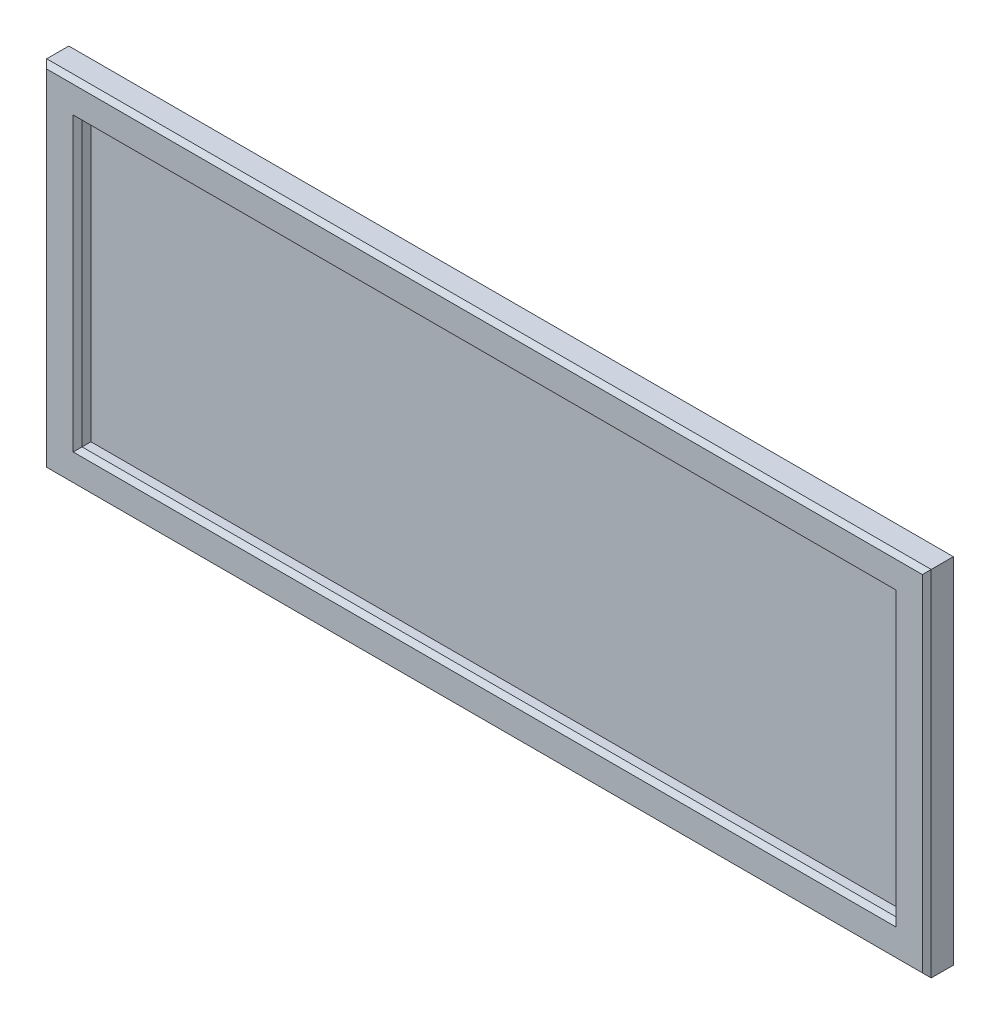
ISO-10303-21;
HEADER;
FILE_DESCRIPTION(('STEP AP214'),'2;1');
FILE_NAME('part.step','',(''),(''),'','','');
FILE_SCHEMA(('AUTOMOTIVE_DESIGN { 1 0 10303 214 1 1 1 1 }'));
ENDSEC;
DATA;
#1=APPLICATION_CONTEXT('core data for automotive mechanical design processes');
#2=APPLICATION_PROTOCOL_DEFINITION('international standard','automotive_design',2000,#1);
#3=PRODUCT_CONTEXT('',#1,'mechanical');
#4=PRODUCT('Part','Part','',(#3));
#5=PRODUCT_RELATED_PRODUCT_CATEGORY('part','',(#4));
#6=PRODUCT_DEFINITION_FORMATION('','',#4);
#7=PRODUCT_DEFINITION_CONTEXT('part definition',#1,'design');
#8=PRODUCT_DEFINITION('design','',#6,#7);
#9=PRODUCT_DEFINITION_SHAPE('','',#8);
#10=(LENGTH_UNIT() NAMED_UNIT(*) SI_UNIT(.MILLI.,.METRE.));
#11=(NAMED_UNIT(*) PLANE_ANGLE_UNIT() SI_UNIT($,.RADIAN.));
#12=(NAMED_UNIT(*) SI_UNIT($,.STERADIAN.) SOLID_ANGLE_UNIT());
#13=UNCERTAINTY_MEASURE_WITH_UNIT(LENGTH_MEASURE(1.E-05),#10,'distance_accuracy_value','');
#14=(GEOMETRIC_REPRESENTATION_CONTEXT(3) GLOBAL_UNCERTAINTY_ASSIGNED_CONTEXT((#13)) GLOBAL_UNIT_ASSIGNED_CONTEXT((#10,
#11,#12)) REPRESENTATION_CONTEXT('',''));
#15=CARTESIAN_POINT('',(0.,0.,0.));
#16=DIRECTION('',(0.,0.,1.));
#17=DIRECTION('',(1.,0.,0.));
#18=AXIS2_PLACEMENT_3D('',#15,#16,#17);
#19=CARTESIAN_POINT('',(1958.91593468016,752.055348931836,30.));
#20=DIRECTION('',(1.,0.,0.));
#21=DIRECTION('',(0.,0.,-1.));
#22=AXIS2_PLACEMENT_3D('',#19,#20,#21);
#23=PLANE('',#22);
#24=DIRECTION('',(0.,-1.,0.));
#25=VECTOR('',#24,1.);
#26=CARTESIAN_POINT('',(1958.91593468016,752.055348931836,20.));
#27=LINE('',#26,#25);
#28=CARTESIAN_POINT('',(1958.91593468016,752.055348931836,20.));
#29=VERTEX_POINT('',#28);
#30=CARTESIAN_POINT('',(1958.91593468016,37.5133814701847,20.));
#31=VERTEX_POINT('',#30);
#32=EDGE_CURVE('E119',#29,#31,#27,.T.);
#33=ORIENTED_EDGE('',*,*,#32,.F.);
#34=DIRECTION('',(0.,0.,-1.));
#35=VECTOR('',#34,1.);
#36=CARTESIAN_POINT('',(1958.91593468016,752.055348931836,30.));
#37=LINE('',#36,#35);
#38=CARTESIAN_POINT('',(1958.91593468016,752.055348931836,30.));
#39=VERTEX_POINT('',#38);
#40=EDGE_CURVE('E12',#39,#29,#37,.T.);
#41=ORIENTED_EDGE('',*,*,#40,.F.);
#42=DIRECTION('',(0.,-1.,0.));
#43=VECTOR('',#42,1.);
#44=CARTESIAN_POINT('',(1958.91593468016,752.055348931836,30.));
#45=LINE('',#44,#43);
#46=CARTESIAN_POINT('',(1958.91593468016,37.5133814701847,30.));
#47=VERTEX_POINT('',#46);
#48=EDGE_CURVE('E113',#39,#47,#45,.T.);
#49=ORIENTED_EDGE('',*,*,#48,.T.);
#50=DIRECTION('',(0.,0.,-1.));
#51=VECTOR('',#50,1.);
#52=CARTESIAN_POINT('',(1958.91593468016,37.5133814701847,30.));
#53=LINE('',#52,#51);
#54=EDGE_CURVE('E58',#47,#31,#53,.T.);
#55=ORIENTED_EDGE('',*,*,#54,.T.);
#56=EDGE_LOOP('',(#33,#41,#49,#55));
#57=FACE_BOUND('',#56,.T.);
#58=ADVANCED_FACE('F55',(#57),#23,.T.);
#59=CARTESIAN_POINT('',(1958.91593468016,752.055348931836,30.));
#60=DIRECTION('',(0.,1.,0.));
#61=DIRECTION('',(0.,0.,1.));
#62=AXIS2_PLACEMENT_3D('',#59,#60,#61);
#63=PLANE('',#62);
#64=DIRECTION('',(1.,0.,0.));
#65=VECTOR('',#64,1.);
#66=CARTESIAN_POINT('',(1958.91593468016,752.055348931836,20.));
#67=LINE('',#66,#65);
#68=CARTESIAN_POINT('',(41.8597438026764,752.055348931836,20.));
#69=VERTEX_POINT('',#68);
#70=EDGE_CURVE('E115',#69,#29,#67,.T.);
#71=ORIENTED_EDGE('',*,*,#70,.F.);
#72=DIRECTION('',(0.,0.,-1.));
#73=VECTOR('',#72,1.);
#74=CARTESIAN_POINT('',(41.8597438026764,752.055348931836,30.));
#75=LINE('',#74,#73);
#76=CARTESIAN_POINT('',(41.8597438026764,752.055348931836,30.));
#77=VERTEX_POINT('',#76);
#78=EDGE_CURVE('E64',#77,#69,#75,.T.);
#79=ORIENTED_EDGE('',*,*,#78,.F.);
#80=DIRECTION('',(1.,0.,0.));
#81=VECTOR('',#80,1.);
#82=CARTESIAN_POINT('',(1958.91593468016,752.055348931836,30.));
#83=LINE('',#82,#81);
#84=EDGE_CURVE('E110',#77,#39,#83,.T.);
#85=ORIENTED_EDGE('',*,*,#84,.T.);
#86=ORIENTED_EDGE('',*,*,#40,.T.);
#87=EDGE_LOOP('',(#71,#79,#85,#86));
#88=FACE_BOUND('',#87,.T.);
#89=ADVANCED_FACE('F129',(#88),#63,.T.);
#90=CARTESIAN_POINT('',(41.8597438026764,752.055348931836,30.));
#91=DIRECTION('',(-1.,0.,0.));
#92=DIRECTION('',(0.,0.,1.));
#93=AXIS2_PLACEMENT_3D('',#90,#91,#92);
#94=PLANE('',#93);
#95=DIRECTION('',(0.,1.,0.));
#96=VECTOR('',#95,1.);
#97=CARTESIAN_POINT('',(41.8597438026764,752.055348931836,20.));
#98=LINE('',#97,#96);
#99=CARTESIAN_POINT('',(41.8597438026764,37.5133814701847,20.));
#100=VERTEX_POINT('',#99);
#101=EDGE_CURVE('E105',#100,#69,#98,.T.);
#102=ORIENTED_EDGE('',*,*,#101,.F.);
#103=DIRECTION('',(0.,0.,-1.));
#104=VECTOR('',#103,1.);
#105=CARTESIAN_POINT('',(41.8597438026764,37.5133814701847,30.));
#106=LINE('',#105,#104);
#107=CARTESIAN_POINT('',(41.8597438026764,37.5133814701847,30.));
#108=VERTEX_POINT('',#107);
#109=EDGE_CURVE('E100',#108,#100,#106,.T.);
#110=ORIENTED_EDGE('',*,*,#109,.F.);
#111=DIRECTION('',(0.,1.,0.));
#112=VECTOR('',#111,1.);
#113=CARTESIAN_POINT('',(41.8597438026764,752.055348931836,30.));
#114=LINE('',#113,#112);
#115=EDGE_CURVE('E103',#108,#77,#114,.T.);
#116=ORIENTED_EDGE('',*,*,#115,.T.);
#117=ORIENTED_EDGE('',*,*,#78,.T.);
#118=EDGE_LOOP('',(#102,#110,#116,#117));
#119=FACE_BOUND('',#118,.T.);
#120=ADVANCED_FACE('F102',(#119),#94,.T.);
#121=CARTESIAN_POINT('',(1958.91593468016,37.5133814701847,30.));
#122=DIRECTION('',(0.,-1.,0.));
#123=DIRECTION('',(0.,0.,-1.));
#124=AXIS2_PLACEMENT_3D('',#121,#122,#123);
#125=PLANE('',#124);
#126=DIRECTION('',(-1.,0.,0.));
#127=VECTOR('',#126,1.);
#128=CARTESIAN_POINT('',(1958.91593468016,37.5133814701847,20.));
#129=LINE('',#128,#127);
#130=EDGE_CURVE('E122',#31,#100,#129,.T.);
#131=ORIENTED_EDGE('',*,*,#130,.F.);
#132=ORIENTED_EDGE('',*,*,#54,.F.);
#133=DIRECTION('',(-1.,0.,0.));
#134=VECTOR('',#133,1.);
#135=CARTESIAN_POINT('',(1958.91593468016,37.5133814701847,30.));
#136=LINE('',#135,#134);
#137=EDGE_CURVE('E109',#47,#108,#136,.T.);
#138=ORIENTED_EDGE('',*,*,#137,.T.);
#139=ORIENTED_EDGE('',*,*,#109,.T.);
#140=EDGE_LOOP('',(#131,#132,#138,#139));
#141=FACE_BOUND('',#140,.T.);
#142=ADVANCED_FACE('F112',(#141),#125,.T.);
#143=CARTESIAN_POINT('',(0.,0.,30.));
#144=DIRECTION('',(0.,0.,-1.));
#145=DIRECTION('',(-1.,0.,0.));
#146=AXIS2_PLACEMENT_3D('',#143,#144,#145);
#147=PLANE('',#146);
#148=ORIENTED_EDGE('',*,*,#48,.F.);
#149=ORIENTED_EDGE('',*,*,#84,.F.);
#150=ORIENTED_EDGE('',*,*,#115,.F.);
#151=ORIENTED_EDGE('',*,*,#137,.F.);
#152=EDGE_LOOP('',(#148,#149,#150,#151));
#153=FACE_BOUND('',#152,.T.);
#154=ADVANCED_FACE('F108',(#153),#147,.F.);
#155=CARTESIAN_POINT('',(0.,0.,20.));
#156=DIRECTION('',(0.,0.,-1.));
#157=DIRECTION('',(-1.,0.,0.));
#158=AXIS2_PLACEMENT_3D('',#155,#156,#157);
#159=PLANE('',#158);
#160=ORIENTED_EDGE('',*,*,#32,.T.);
#161=ORIENTED_EDGE('',*,*,#130,.T.);
#162=ORIENTED_EDGE('',*,*,#101,.T.);
#163=ORIENTED_EDGE('',*,*,#70,.T.);
#164=EDGE_LOOP('',(#160,#161,#162,#163));
#165=FACE_BOUND('',#164,.T.);
#166=ADVANCED_FACE('F128',(#165),#159,.T.);
#167=CLOSED_SHELL('',(#58,#89,#120,#142,#154,#166));
#168=MANIFOLD_SOLID_BREP('B2',#167);
#169=CARTESIAN_POINT('',(0.,0.,60.));
#170=DIRECTION('',(0.,0.,-1.));
#171=DIRECTION('',(-1.,0.,0.));
#172=AXIS2_PLACEMENT_3D('',#169,#170,#171);
#173=PLANE('',#172);
#174=DIRECTION('',(1.,0.,0.));
#175=VECTOR('',#174,1.);
#176=CARTESIAN_POINT('',(1920.,730.,60.));
#177=LINE('',#176,#175);
#178=CARTESIAN_POINT('',(69.9999999999998,730.,60.));
#179=VERTEX_POINT('',#178);
#180=CARTESIAN_POINT('',(1930.,730.,60.));
#181=VERTEX_POINT('',#180);
#182=EDGE_CURVE('E344',#179,#181,#177,.T.);
#183=ORIENTED_EDGE('',*,*,#182,.T.);
#184=DIRECTION('',(0.,-1.,0.));
#185=VECTOR('',#184,1.);
#186=CARTESIAN_POINT('',(1930.,80.,60.));
#187=LINE('',#186,#185);
#188=CARTESIAN_POINT('',(1930.,69.9999999999998,60.));
#189=VERTEX_POINT('',#188);
#190=EDGE_CURVE('E346',#181,#189,#187,.T.);
#191=ORIENTED_EDGE('',*,*,#190,.T.);
#192=DIRECTION('',(-1.,0.,0.));
#193=VECTOR('',#192,1.);
#194=CARTESIAN_POINT('',(80.,69.9999999999998,60.));
#195=LINE('',#194,#193);
#196=CARTESIAN_POINT('',(69.9999999999998,69.9999999999998,60.));
#197=VERTEX_POINT('',#196);
#198=EDGE_CURVE('E340',#189,#197,#195,.T.);
#199=ORIENTED_EDGE('',*,*,#198,.T.);
#200=DIRECTION('',(0.,1.,0.));
#201=VECTOR('',#200,1.);
#202=CARTESIAN_POINT('',(69.9999999999998,720.,60.));
#203=LINE('',#202,#201);
#204=EDGE_CURVE('E342',#197,#179,#203,.T.);
#205=ORIENTED_EDGE('',*,*,#204,.T.);
#206=EDGE_LOOP('',(#183,#191,#199,#205));
#207=FACE_BOUND('',#206,.T.);
#208=DIRECTION('',(0.,1.,0.));
#209=VECTOR('',#208,1.);
#210=CARTESIAN_POINT('',(1990.,0.,60.));
#211=LINE('',#210,#209);
#212=CARTESIAN_POINT('',(1990.,10.,60.));
#213=VERTEX_POINT('',#212);
#214=CARTESIAN_POINT('',(1990.,790.,60.));
#215=VERTEX_POINT('',#214);
#216=EDGE_CURVE('E335',#213,#215,#211,.T.);
#217=ORIENTED_EDGE('',*,*,#216,.T.);
#218=DIRECTION('',(-1.,0.,0.));
#219=VECTOR('',#218,1.);
#220=CARTESIAN_POINT('',(0.,790.,60.));
#221=LINE('',#220,#219);
#222=CARTESIAN_POINT('',(10.,790.,60.));
#223=VERTEX_POINT('',#222);
#224=EDGE_CURVE('E337',#215,#223,#221,.T.);
#225=ORIENTED_EDGE('',*,*,#224,.T.);
#226=DIRECTION('',(0.,-1.,0.));
#227=VECTOR('',#226,1.);
#228=CARTESIAN_POINT('',(10.,0.,60.));
#229=LINE('',#228,#227);
#230=CARTESIAN_POINT('',(10.,10.,60.));
#231=VERTEX_POINT('',#230);
#232=EDGE_CURVE('E331',#223,#231,#229,.T.);
#233=ORIENTED_EDGE('',*,*,#232,.T.);
#234=DIRECTION('',(1.,0.,0.));
#235=VECTOR('',#234,1.);
#236=CARTESIAN_POINT('',(0.,10.,60.));
#237=LINE('',#236,#235);
#238=EDGE_CURVE('E333',#231,#213,#237,.T.);
#239=ORIENTED_EDGE('',*,*,#238,.T.);
#240=EDGE_LOOP('',(#217,#225,#233,#239));
#241=FACE_BOUND('',#240,.T.);
#242=ADVANCED_FACE('F179',(#207,#241),#173,.F.);
#243=CARTESIAN_POINT('',(0.,0.,0.));
#244=DIRECTION('',(0.,0.,-1.));
#245=DIRECTION('',(-1.,0.,0.));
#246=AXIS2_PLACEMENT_3D('',#243,#244,#245);
#247=PLANE('',#246);
#248=DIRECTION('',(0.,-1.,0.));
#249=VECTOR('',#248,1.);
#250=CARTESIAN_POINT('',(0.,0.,0.));
#251=LINE('',#250,#249);
#252=CARTESIAN_POINT('',(0.,800.,0.));
#253=VERTEX_POINT('',#252);
#254=CARTESIAN_POINT('',(0.,0.,0.));
#255=VERTEX_POINT('',#254);
#256=EDGE_CURVE('E282',#253,#255,#251,.T.);
#257=ORIENTED_EDGE('',*,*,#256,.F.);
#258=DIRECTION('',(-1.,0.,0.));
#259=VECTOR('',#258,1.);
#260=CARTESIAN_POINT('',(0.,800.,0.));
#261=LINE('',#260,#259);
#262=CARTESIAN_POINT('',(2000.,800.,0.));
#263=VERTEX_POINT('',#262);
#264=EDGE_CURVE('E318',#263,#253,#261,.T.);
#265=ORIENTED_EDGE('',*,*,#264,.F.);
#266=DIRECTION('',(0.,1.,0.));
#267=VECTOR('',#266,1.);
#268=CARTESIAN_POINT('',(2000.,0.,0.));
#269=LINE('',#268,#267);
#270=CARTESIAN_POINT('',(2000.,0.,0.));
#271=VERTEX_POINT('',#270);
#272=EDGE_CURVE('E315',#271,#263,#269,.T.);
#273=ORIENTED_EDGE('',*,*,#272,.F.);
#274=DIRECTION('',(1.,0.,0.));
#275=VECTOR('',#274,1.);
#276=CARTESIAN_POINT('',(0.,0.,0.));
#277=LINE('',#276,#275);
#278=EDGE_CURVE('E312',#255,#271,#277,.T.);
#279=ORIENTED_EDGE('',*,*,#278,.F.);
#280=EDGE_LOOP('',(#257,#265,#273,#279));
#281=FACE_BOUND('',#280,.T.);
#282=DIRECTION('',(0.,-1.,0.));
#283=VECTOR('',#282,1.);
#284=CARTESIAN_POINT('',(80.,80.,0.));
#285=LINE('',#284,#283);
#286=CARTESIAN_POINT('',(80.,720.,0.));
#287=VERTEX_POINT('',#286);
#288=CARTESIAN_POINT('',(80.,80.,0.));
#289=VERTEX_POINT('',#288);
#290=EDGE_CURVE('E296',#287,#289,#285,.T.);
#291=ORIENTED_EDGE('',*,*,#290,.T.);
#292=DIRECTION('',(1.,0.,0.));
#293=VECTOR('',#292,1.);
#294=CARTESIAN_POINT('',(80.,80.,0.));
#295=LINE('',#294,#293);
#296=CARTESIAN_POINT('',(1920.,80.,0.));
#297=VERTEX_POINT('',#296);
#298=EDGE_CURVE('E275',#289,#297,#295,.T.);
#299=ORIENTED_EDGE('',*,*,#298,.T.);
#300=DIRECTION('',(0.,1.,0.));
#301=VECTOR('',#300,1.);
#302=CARTESIAN_POINT('',(1920.,80.,0.));
#303=LINE('',#302,#301);
#304=CARTESIAN_POINT('',(1920.,720.,0.));
#305=VERTEX_POINT('',#304);
#306=EDGE_CURVE('E286',#297,#305,#303,.T.);
#307=ORIENTED_EDGE('',*,*,#306,.T.);
#308=DIRECTION('',(-1.,0.,0.));
#309=VECTOR('',#308,1.);
#310=CARTESIAN_POINT('',(80.,720.,0.));
#311=LINE('',#310,#309);
#312=EDGE_CURVE('E292',#305,#287,#311,.T.);
#313=ORIENTED_EDGE('',*,*,#312,.T.);
#314=EDGE_LOOP('',(#291,#299,#307,#313));
#315=FACE_BOUND('',#314,.T.);
#316=ADVANCED_FACE('F294',(#281,#315),#247,.T.);
#317=CARTESIAN_POINT('',(0.,0.,60.));
#318=DIRECTION('',(1.,0.,0.));
#319=DIRECTION('',(0.,0.,-1.));
#320=AXIS2_PLACEMENT_3D('',#317,#318,#319);
#321=PLANE('',#320);
#322=DIRECTION('',(0.,0.,-1.));
#323=VECTOR('',#322,1.);
#324=CARTESIAN_POINT('',(0.,0.,60.));
#325=LINE('',#324,#323);
#326=CARTESIAN_POINT('',(0.,0.,49.9999999999998));
#327=VERTEX_POINT('',#326);
#328=EDGE_CURVE('E327',#327,#255,#325,.T.);
#329=ORIENTED_EDGE('',*,*,#328,.F.);
#330=DIRECTION('',(0.,1.,0.));
#331=VECTOR('',#330,1.);
#332=CARTESIAN_POINT('',(0.,0.,49.9999999999998));
#333=LINE('',#332,#331);
#334=CARTESIAN_POINT('',(0.,800.,49.9999999999998));
#335=VERTEX_POINT('',#334);
#336=EDGE_CURVE('E53',#327,#335,#333,.T.);
#337=ORIENTED_EDGE('',*,*,#336,.T.);
#338=DIRECTION('',(0.,0.,-1.));
#339=VECTOR('',#338,1.);
#340=CARTESIAN_POINT('',(0.,800.,60.));
#341=LINE('',#340,#339);
#342=EDGE_CURVE('E321',#335,#253,#341,.T.);
#343=ORIENTED_EDGE('',*,*,#342,.T.);
#344=ORIENTED_EDGE('',*,*,#256,.T.);
#345=EDGE_LOOP('',(#329,#337,#343,#344));
#346=FACE_BOUND('',#345,.T.);
#347=ADVANCED_FACE('F386',(#346),#321,.F.);
#348=CARTESIAN_POINT('',(0.,0.,60.));
#349=DIRECTION('',(0.,1.,0.));
#350=DIRECTION('',(0.,0.,1.));
#351=AXIS2_PLACEMENT_3D('',#348,#349,#350);
#352=PLANE('',#351);
#353=DIRECTION('',(0.,0.,-1.));
#354=VECTOR('',#353,1.);
#355=CARTESIAN_POINT('',(2000.,0.,60.));
#356=LINE('',#355,#354);
#357=CARTESIAN_POINT('',(2000.,0.,49.9999999999998));
#358=VERTEX_POINT('',#357);
#359=EDGE_CURVE('E325',#358,#271,#356,.T.);
#360=ORIENTED_EDGE('',*,*,#359,.F.);
#361=DIRECTION('',(-1.,0.,0.));
#362=VECTOR('',#361,1.);
#363=CARTESIAN_POINT('',(0.,0.,49.9999999999998));
#364=LINE('',#363,#362);
#365=EDGE_CURVE('E189',#358,#327,#364,.T.);
#366=ORIENTED_EDGE('',*,*,#365,.T.);
#367=ORIENTED_EDGE('',*,*,#328,.T.);
#368=ORIENTED_EDGE('',*,*,#278,.T.);
#369=EDGE_LOOP('',(#360,#366,#367,#368));
#370=FACE_BOUND('',#369,.T.);
#371=ADVANCED_FACE('F413',(#370),#352,.F.);
#372=CARTESIAN_POINT('',(2000.,0.,60.));
#373=DIRECTION('',(-1.,0.,0.));
#374=DIRECTION('',(0.,0.,1.));
#375=AXIS2_PLACEMENT_3D('',#372,#373,#374);
#376=PLANE('',#375);
#377=DIRECTION('',(0.,0.,-1.));
#378=VECTOR('',#377,1.);
#379=CARTESIAN_POINT('',(2000.,800.,60.));
#380=LINE('',#379,#378);
#381=CARTESIAN_POINT('',(2000.,800.,49.9999999999998));
#382=VERTEX_POINT('',#381);
#383=EDGE_CURVE('E323',#382,#263,#380,.T.);
#384=ORIENTED_EDGE('',*,*,#383,.F.);
#385=DIRECTION('',(0.,-1.,0.));
#386=VECTOR('',#385,1.);
#387=CARTESIAN_POINT('',(2000.,0.,49.9999999999998));
#388=LINE('',#387,#386);
#389=EDGE_CURVE('E204',#382,#358,#388,.T.);
#390=ORIENTED_EDGE('',*,*,#389,.T.);
#391=ORIENTED_EDGE('',*,*,#359,.T.);
#392=ORIENTED_EDGE('',*,*,#272,.T.);
#393=EDGE_LOOP('',(#384,#390,#391,#392));
#394=FACE_BOUND('',#393,.T.);
#395=ADVANCED_FACE('F410',(#394),#376,.F.);
#396=CARTESIAN_POINT('',(0.,800.,60.));
#397=DIRECTION('',(0.,-1.,0.));
#398=DIRECTION('',(0.,0.,-1.));
#399=AXIS2_PLACEMENT_3D('',#396,#397,#398);
#400=PLANE('',#399);
#401=ORIENTED_EDGE('',*,*,#342,.F.);
#402=DIRECTION('',(1.,0.,0.));
#403=VECTOR('',#402,1.);
#404=CARTESIAN_POINT('',(0.,800.,49.9999999999998));
#405=LINE('',#404,#403);
#406=EDGE_CURVE('E354',#335,#382,#405,.T.);
#407=ORIENTED_EDGE('',*,*,#406,.T.);
#408=ORIENTED_EDGE('',*,*,#383,.T.);
#409=ORIENTED_EDGE('',*,*,#264,.T.);
#410=EDGE_LOOP('',(#401,#407,#408,#409));
#411=FACE_BOUND('',#410,.T.);
#412=ADVANCED_FACE('F389',(#411),#400,.F.);
#413=CARTESIAN_POINT('',(80.,80.,60.));
#414=DIRECTION('',(0.,1.,0.));
#415=DIRECTION('',(0.,0.,1.));
#416=AXIS2_PLACEMENT_3D('',#413,#414,#415);
#417=PLANE('',#416);
#418=DIRECTION('',(0.,0.,-1.));
#419=VECTOR('',#418,1.);
#420=CARTESIAN_POINT('',(80.,80.,60.));
#421=LINE('',#420,#419);
#422=CARTESIAN_POINT('',(80.,80.,50.));
#423=VERTEX_POINT('',#422);
#424=EDGE_CURVE('E305',#423,#289,#421,.T.);
#425=ORIENTED_EDGE('',*,*,#424,.F.);
#426=DIRECTION('',(1.,0.,0.));
#427=VECTOR('',#426,1.);
#428=CARTESIAN_POINT('',(1920.,80.,50.));
#429=LINE('',#428,#427);
#430=CARTESIAN_POINT('',(1920.,80.,50.));
#431=VERTEX_POINT('',#430);
#432=EDGE_CURVE('E278',#423,#431,#429,.T.);
#433=ORIENTED_EDGE('',*,*,#432,.T.);
#434=DIRECTION('',(0.,0.,-1.));
#435=VECTOR('',#434,1.);
#436=CARTESIAN_POINT('',(1920.,80.,60.));
#437=LINE('',#436,#435);
#438=EDGE_CURVE('E270',#431,#297,#437,.T.);
#439=ORIENTED_EDGE('',*,*,#438,.T.);
#440=ORIENTED_EDGE('',*,*,#298,.F.);
#441=EDGE_LOOP('',(#425,#433,#439,#440));
#442=FACE_BOUND('',#441,.T.);
#443=ADVANCED_FACE('F273',(#442),#417,.T.);
#444=CARTESIAN_POINT('',(1920.,80.,60.));
#445=DIRECTION('',(-1.,0.,0.));
#446=DIRECTION('',(0.,0.,1.));
#447=AXIS2_PLACEMENT_3D('',#444,#445,#446);
#448=PLANE('',#447);
#449=ORIENTED_EDGE('',*,*,#438,.F.);
#450=DIRECTION('',(0.,1.,0.));
#451=VECTOR('',#450,1.);
#452=CARTESIAN_POINT('',(1920.,720.,50.));
#453=LINE('',#452,#451);
#454=CARTESIAN_POINT('',(1920.,720.,50.));
#455=VERTEX_POINT('',#454);
#456=EDGE_CURVE('E329',#431,#455,#453,.T.);
#457=ORIENTED_EDGE('',*,*,#456,.T.);
#458=DIRECTION('',(0.,0.,-1.));
#459=VECTOR('',#458,1.);
#460=CARTESIAN_POINT('',(1920.,720.,60.));
#461=LINE('',#460,#459);
#462=EDGE_CURVE('E283',#455,#305,#461,.T.);
#463=ORIENTED_EDGE('',*,*,#462,.T.);
#464=ORIENTED_EDGE('',*,*,#306,.F.);
#465=EDGE_LOOP('',(#449,#457,#463,#464));
#466=FACE_BOUND('',#465,.T.);
#467=ADVANCED_FACE('F287',(#466),#448,.T.);
#468=CARTESIAN_POINT('',(80.,720.,60.));
#469=DIRECTION('',(0.,-1.,0.));
#470=DIRECTION('',(0.,0.,-1.));
#471=AXIS2_PLACEMENT_3D('',#468,#469,#470);
#472=PLANE('',#471);
#473=ORIENTED_EDGE('',*,*,#462,.F.);
#474=DIRECTION('',(-1.,0.,0.));
#475=VECTOR('',#474,1.);
#476=CARTESIAN_POINT('',(80.,720.,50.));
#477=LINE('',#476,#475);
#478=CARTESIAN_POINT('',(80.,720.,50.));
#479=VERTEX_POINT('',#478);
#480=EDGE_CURVE('E349',#455,#479,#477,.T.);
#481=ORIENTED_EDGE('',*,*,#480,.T.);
#482=DIRECTION('',(0.,0.,-1.));
#483=VECTOR('',#482,1.);
#484=CARTESIAN_POINT('',(80.,720.,60.));
#485=LINE('',#484,#483);
#486=EDGE_CURVE('E307',#479,#287,#485,.T.);
#487=ORIENTED_EDGE('',*,*,#486,.T.);
#488=ORIENTED_EDGE('',*,*,#312,.F.);
#489=EDGE_LOOP('',(#473,#481,#487,#488));
#490=FACE_BOUND('',#489,.T.);
#491=ADVANCED_FACE('F491',(#490),#472,.T.);
#492=CARTESIAN_POINT('',(80.,80.,60.));
#493=DIRECTION('',(1.,0.,0.));
#494=DIRECTION('',(0.,0.,-1.));
#495=AXIS2_PLACEMENT_3D('',#492,#493,#494);
#496=PLANE('',#495);
#497=ORIENTED_EDGE('',*,*,#486,.F.);
#498=DIRECTION('',(0.,-1.,0.));
#499=VECTOR('',#498,1.);
#500=CARTESIAN_POINT('',(80.,80.,50.));
#501=LINE('',#500,#499);
#502=EDGE_CURVE('E351',#479,#423,#501,.T.);
#503=ORIENTED_EDGE('',*,*,#502,.T.);
#504=ORIENTED_EDGE('',*,*,#424,.T.);
#505=ORIENTED_EDGE('',*,*,#290,.F.);
#506=EDGE_LOOP('',(#497,#503,#504,#505));
#507=FACE_BOUND('',#506,.T.);
#508=ADVANCED_FACE('F444',(#507),#496,.T.);
#509=CARTESIAN_POINT('',(80.,80.,50.));
#510=DIRECTION('',(0.70710678118654,0.,0.707106781186555));
#511=DIRECTION('',(0.,1.,0.));
#512=AXIS2_PLACEMENT_3D('',#509,#510,#511);
#513=PLANE('',#512);
#514=DIRECTION('',(-0.57735026918963,0.57735026918963,0.577350269189617));
#515=VECTOR('',#514,1.);
#516=CARTESIAN_POINT('',(80.,720.,50.));
#517=LINE('',#516,#515);
#518=EDGE_CURVE('E300',#179,#479,#517,.F.);
#519=ORIENTED_EDGE('',*,*,#518,.F.);
#520=ORIENTED_EDGE('',*,*,#204,.F.);
#521=DIRECTION('',(-0.57735026918963,-0.57735026918963,0.577350269189617));
#522=VECTOR('',#521,1.);
#523=CARTESIAN_POINT('',(80.,80.,50.));
#524=LINE('',#523,#522);
#525=EDGE_CURVE('E297',#423,#197,#524,.T.);
#526=ORIENTED_EDGE('',*,*,#525,.F.);
#527=ORIENTED_EDGE('',*,*,#502,.F.);
#528=EDGE_LOOP('',(#519,#520,#526,#527));
#529=FACE_BOUND('',#528,.T.);
#530=ADVANCED_FACE('F438',(#529),#513,.T.);
#531=CARTESIAN_POINT('',(80.,80.,50.));
#532=DIRECTION('',(0.,0.70710678118654,0.707106781186555));
#533=DIRECTION('',(-1.,0.,0.));
#534=AXIS2_PLACEMENT_3D('',#531,#532,#533);
#535=PLANE('',#534);
#536=ORIENTED_EDGE('',*,*,#525,.T.);
#537=ORIENTED_EDGE('',*,*,#198,.F.);
#538=DIRECTION('',(-0.57735026918963,0.57735026918963,-0.577350269189617));
#539=VECTOR('',#538,1.);
#540=CARTESIAN_POINT('',(1920.,80.,50.));
#541=LINE('',#540,#539);
#542=EDGE_CURVE('E361',#431,#189,#541,.F.);
#543=ORIENTED_EDGE('',*,*,#542,.F.);
#544=ORIENTED_EDGE('',*,*,#432,.F.);
#545=EDGE_LOOP('',(#536,#537,#543,#544));
#546=FACE_BOUND('',#545,.T.);
#547=ADVANCED_FACE('F431',(#546),#535,.T.);
#548=CARTESIAN_POINT('',(80.,720.,50.));
#549=DIRECTION('',(0.,-0.70710678118654,0.707106781186555));
#550=DIRECTION('',(1.,0.,0.));
#551=AXIS2_PLACEMENT_3D('',#548,#549,#550);
#552=PLANE('',#551);
#553=ORIENTED_EDGE('',*,*,#518,.T.);
#554=ORIENTED_EDGE('',*,*,#480,.F.);
#555=DIRECTION('',(0.57735026918963,0.57735026918963,0.577350269189617));
#556=VECTOR('',#555,1.);
#557=CARTESIAN_POINT('',(1706.66666666666,506.666666666664,-163.333333333332));
#558=LINE('',#557,#556);
#559=EDGE_CURVE('E359',#181,#455,#558,.F.);
#560=ORIENTED_EDGE('',*,*,#559,.F.);
#561=ORIENTED_EDGE('',*,*,#182,.F.);
#562=EDGE_LOOP('',(#553,#554,#560,#561));
#563=FACE_BOUND('',#562,.T.);
#564=ADVANCED_FACE('F424',(#563),#552,.T.);
#565=CARTESIAN_POINT('',(1920.,80.,50.));
#566=DIRECTION('',(-0.70710678118654,0.,0.707106781186555));
#567=DIRECTION('',(0.,-1.,0.));
#568=AXIS2_PLACEMENT_3D('',#565,#566,#567);
#569=PLANE('',#568);
#570=ORIENTED_EDGE('',*,*,#542,.T.);
#571=ORIENTED_EDGE('',*,*,#190,.F.);
#572=ORIENTED_EDGE('',*,*,#559,.T.);
#573=ORIENTED_EDGE('',*,*,#456,.F.);
#574=EDGE_LOOP('',(#570,#571,#572,#573));
#575=FACE_BOUND('',#574,.T.);
#576=ADVANCED_FACE('F418',(#575),#569,.T.);
#577=CARTESIAN_POINT('',(0.,10.,60.));
#578=DIRECTION('',(0.,0.707106781186555,-0.707106781186539));
#579=DIRECTION('',(1.,0.,0.));
#580=AXIS2_PLACEMENT_3D('',#577,#578,#579);
#581=PLANE('',#580);
#582=DIRECTION('',(0.577350269189621,0.577350269189621,0.577350269189635));
#583=VECTOR('',#582,1.);
#584=CARTESIAN_POINT('',(6.66666666666672,6.66666666666672,56.6666666666666));
#585=LINE('',#584,#583);
#586=EDGE_CURVE('E368',#327,#231,#585,.T.);
#587=ORIENTED_EDGE('',*,*,#586,.F.);
#588=ORIENTED_EDGE('',*,*,#365,.F.);
#589=DIRECTION('',(-0.577350269189622,0.577350269189621,0.577350269189634));
#590=VECTOR('',#589,1.);
#591=CARTESIAN_POINT('',(1326.66666666668,673.333333333323,723.333333333338));
#592=LINE('',#591,#590);
#593=EDGE_CURVE('E184',#213,#358,#592,.F.);
#594=ORIENTED_EDGE('',*,*,#593,.F.);
#595=ORIENTED_EDGE('',*,*,#238,.F.);
#596=EDGE_LOOP('',(#587,#588,#594,#595));
#597=FACE_BOUND('',#596,.T.);
#598=ADVANCED_FACE('F182',(#597),#581,.F.);
#599=CARTESIAN_POINT('',(1990.,0.,60.));
#600=DIRECTION('',(-0.707106781186555,0.,-0.70710678118654));
#601=DIRECTION('',(0.,1.,0.));
#602=AXIS2_PLACEMENT_3D('',#599,#600,#601);
#603=PLANE('',#602);
#604=ORIENTED_EDGE('',*,*,#593,.T.);
#605=ORIENTED_EDGE('',*,*,#389,.F.);
#606=DIRECTION('',(-0.577350269189622,-0.577350269189622,0.577350269189634));
#607=VECTOR('',#606,1.);
#608=CARTESIAN_POINT('',(1726.66666666667,526.666666666671,323.333333333335));
#609=LINE('',#608,#607);
#610=EDGE_CURVE('E367',#215,#382,#609,.F.);
#611=ORIENTED_EDGE('',*,*,#610,.F.);
#612=ORIENTED_EDGE('',*,*,#216,.F.);
#613=EDGE_LOOP('',(#604,#605,#611,#612));
#614=FACE_BOUND('',#613,.T.);
#615=ADVANCED_FACE('F378',(#614),#603,.F.);
#616=CARTESIAN_POINT('',(10.,0.,60.));
#617=DIRECTION('',(0.707106781186555,0.,-0.707106781186539));
#618=DIRECTION('',(0.,-1.,0.));
#619=AXIS2_PLACEMENT_3D('',#616,#617,#618);
#620=PLANE('',#619);
#621=ORIENTED_EDGE('',*,*,#586,.T.);
#622=ORIENTED_EDGE('',*,*,#232,.F.);
#623=DIRECTION('',(-0.577350269189621,0.577350269189622,-0.577350269189634));
#624=VECTOR('',#623,1.);
#625=CARTESIAN_POINT('',(273.333333333329,526.66666666667,323.333333333335));
#626=LINE('',#625,#624);
#627=EDGE_CURVE('E365',#335,#223,#626,.F.);
#628=ORIENTED_EDGE('',*,*,#627,.F.);
#629=ORIENTED_EDGE('',*,*,#336,.F.);
#630=EDGE_LOOP('',(#621,#622,#628,#629));
#631=FACE_BOUND('',#630,.T.);
#632=ADVANCED_FACE('F383',(#631),#620,.F.);
#633=CARTESIAN_POINT('',(0.,790.,60.));
#634=DIRECTION('',(0.,-0.707106781186555,-0.70710678118654));
#635=DIRECTION('',(-1.,0.,0.));
#636=AXIS2_PLACEMENT_3D('',#633,#634,#635);
#637=PLANE('',#636);
#638=ORIENTED_EDGE('',*,*,#610,.T.);
#639=ORIENTED_EDGE('',*,*,#406,.F.);
#640=ORIENTED_EDGE('',*,*,#627,.T.);
#641=ORIENTED_EDGE('',*,*,#224,.F.);
#642=EDGE_LOOP('',(#638,#639,#640,#641));
#643=FACE_BOUND('',#642,.T.);
#644=ADVANCED_FACE('F393',(#643),#637,.F.);
#645=CLOSED_SHELL('',(#242,#316,#347,#371,#395,#412,#443,#467,#491,#508,#530,#547,#564,#576,
#598,#615,#632,#644));
#646=MANIFOLD_SOLID_BREP('B6',#645);
#647=ADVANCED_BREP_SHAPE_REPRESENTATION('',(#18,#168,#646),#14);
#648=SHAPE_DEFINITION_REPRESENTATION(#9,#647);
ENDSEC;
END-ISO-10303-21;
